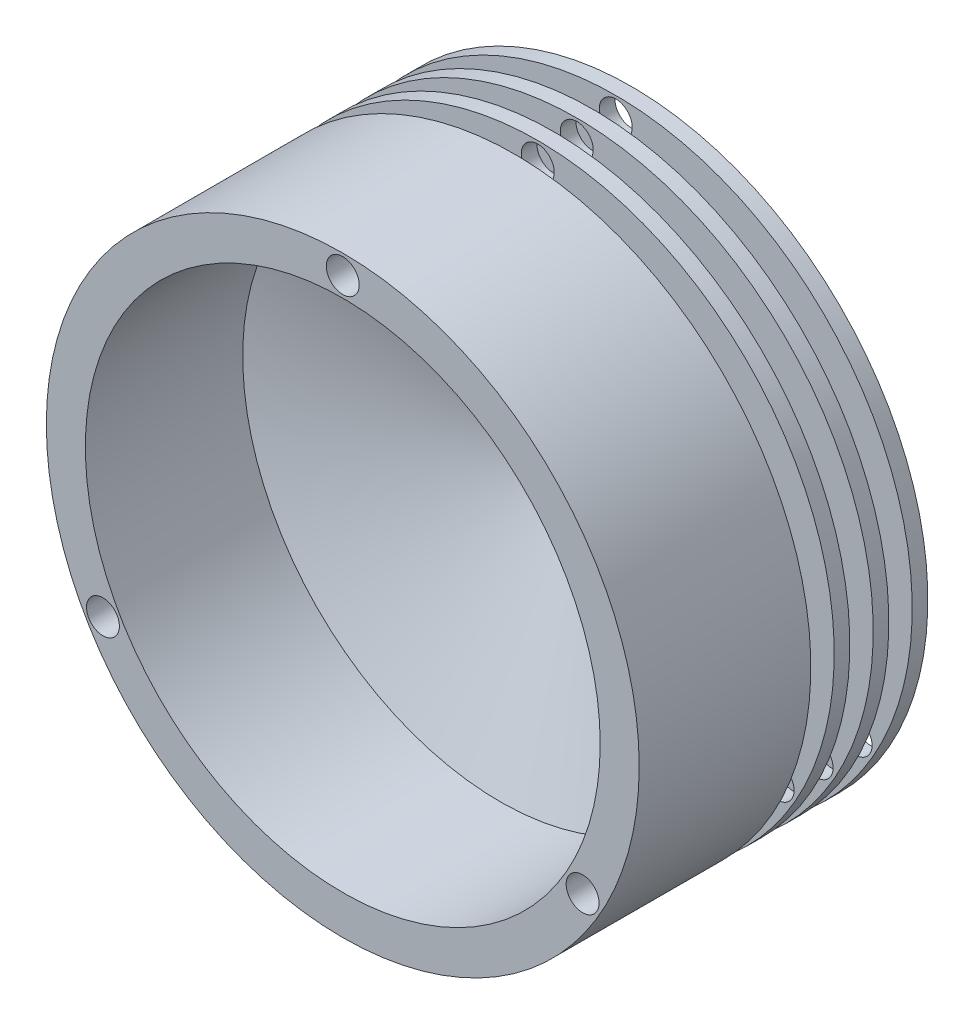
ISO-10303-21;
HEADER;
FILE_DESCRIPTION(('STEP AP214'),'2;1');
FILE_NAME('part.step','',(''),(''),'','','');
FILE_SCHEMA(('AUTOMOTIVE_DESIGN { 1 0 10303 214 1 1 1 1 }'));
ENDSEC;
DATA;
#1=APPLICATION_CONTEXT('core data for automotive mechanical design processes');
#2=APPLICATION_PROTOCOL_DEFINITION('international standard','automotive_design',2000,#1);
#3=PRODUCT_CONTEXT('',#1,'mechanical');
#4=PRODUCT('Part','Part','',(#3));
#5=PRODUCT_RELATED_PRODUCT_CATEGORY('part','',(#4));
#6=PRODUCT_DEFINITION_FORMATION('','',#4);
#7=PRODUCT_DEFINITION_CONTEXT('part definition',#1,'design');
#8=PRODUCT_DEFINITION('design','',#6,#7);
#9=PRODUCT_DEFINITION_SHAPE('','',#8);
#10=(LENGTH_UNIT() NAMED_UNIT(*) SI_UNIT(.MILLI.,.METRE.));
#11=(NAMED_UNIT(*) PLANE_ANGLE_UNIT() SI_UNIT($,.RADIAN.));
#12=(NAMED_UNIT(*) SI_UNIT($,.STERADIAN.) SOLID_ANGLE_UNIT());
#13=UNCERTAINTY_MEASURE_WITH_UNIT(LENGTH_MEASURE(1.E-05),#10,'distance_accuracy_value','');
#14=(GEOMETRIC_REPRESENTATION_CONTEXT(3) GLOBAL_UNCERTAINTY_ASSIGNED_CONTEXT((#13)) GLOBAL_UNIT_ASSIGNED_CONTEXT((#10,
#11,#12)) REPRESENTATION_CONTEXT('',''));
#15=CARTESIAN_POINT('',(0.,0.,0.));
#16=DIRECTION('',(0.,0.,1.));
#17=DIRECTION('',(1.,0.,0.));
#18=AXIS2_PLACEMENT_3D('',#15,#16,#17);
#19=CARTESIAN_POINT('',(0.,0.,20.));
#20=DIRECTION('',(0.,0.,-1.));
#21=DIRECTION('',(-1.,0.,0.));
#22=AXIS2_PLACEMENT_3D('',#19,#20,#21);
#23=CYLINDRICAL_SURFACE('',#22,38.);
#24=CARTESIAN_POINT('',(0.,0.,20.));
#25=DIRECTION('',(0.,0.,1.));
#26=DIRECTION('',(1.,0.,0.));
#27=AXIS2_PLACEMENT_3D('',#24,#25,#26);
#28=CIRCLE('',#27,38.);
#29=CARTESIAN_POINT('',(38.,0.,20.));
#30=VERTEX_POINT('',#29);
#31=EDGE_CURVE('E55',#30,#30,#28,.T.);
#32=ORIENTED_EDGE('',*,*,#31,.F.);
#33=EDGE_LOOP('',(#32));
#34=FACE_BOUND('',#33,.T.);
#35=CARTESIAN_POINT('',(0.,0.,-2.));
#36=DIRECTION('',(0.,0.,-1.));
#37=DIRECTION('',(-1.,0.,0.));
#38=AXIS2_PLACEMENT_3D('',#35,#36,#37);
#39=CIRCLE('',#38,38.);
#40=CARTESIAN_POINT('',(-38.,0.,-2.));
#41=VERTEX_POINT('',#40);
#42=EDGE_CURVE('E160',#41,#41,#39,.T.);
#43=ORIENTED_EDGE('',*,*,#42,.F.);
#44=EDGE_LOOP('',(#43));
#45=FACE_BOUND('',#44,.T.);
#46=ADVANCED_FACE('F39',(#34,#45),#23,.T.);
#47=CARTESIAN_POINT('',(0.,0.,-15.));
#48=DIRECTION('',(0.,0.,-1.));
#49=DIRECTION('',(-1.,0.,0.));
#50=AXIS2_PLACEMENT_3D('',#47,#48,#49);
#51=CIRCLE('',#50,38.);
#52=CARTESIAN_POINT('',(-38.,0.,-15.));
#53=VERTEX_POINT('',#52);
#54=EDGE_CURVE('E137',#53,#53,#51,.T.);
#55=ORIENTED_EDGE('',*,*,#54,.T.);
#56=EDGE_LOOP('',(#55));
#57=FACE_BOUND('',#56,.T.);
#58=CARTESIAN_POINT('',(0.,0.,-17.));
#59=DIRECTION('',(0.,0.,-1.));
#60=DIRECTION('',(-1.,0.,0.));
#61=AXIS2_PLACEMENT_3D('',#58,#59,#60);
#62=CIRCLE('',#61,38.);
#63=CARTESIAN_POINT('',(-38.,0.,-17.));
#64=VERTEX_POINT('',#63);
#65=EDGE_CURVE('E185',#64,#64,#62,.T.);
#66=ORIENTED_EDGE('',*,*,#65,.F.);
#67=EDGE_LOOP('',(#66));
#68=FACE_BOUND('',#67,.T.);
#69=ADVANCED_FACE('F208',(#57,#68),#23,.T.);
#70=CARTESIAN_POINT('',(0.,0.,-20.));
#71=DIRECTION('',(0.,0.,-1.));
#72=DIRECTION('',(-1.,0.,0.));
#73=AXIS2_PLACEMENT_3D('',#70,#71,#72);
#74=PLANE('',#73);
#75=CARTESIAN_POINT('',(0.,0.,-20.));
#76=DIRECTION('',(0.,0.,-1.));
#77=DIRECTION('',(-1.,0.,0.));
#78=AXIS2_PLACEMENT_3D('',#75,#76,#77);
#79=CIRCLE('',#78,6.);
#80=CARTESIAN_POINT('',(-6.,0.,-20.));
#81=VERTEX_POINT('',#80);
#82=EDGE_CURVE('E192',#81,#81,#79,.T.);
#83=ORIENTED_EDGE('',*,*,#82,.F.);
#84=EDGE_LOOP('',(#83));
#85=FACE_BOUND('',#84,.T.);
#86=CARTESIAN_POINT('',(0.,0.,-20.));
#87=DIRECTION('',(0.,0.,-1.));
#88=DIRECTION('',(-1.,0.,0.));
#89=AXIS2_PLACEMENT_3D('',#86,#87,#88);
#90=CIRCLE('',#89,29.);
#91=CARTESIAN_POINT('',(-29.,0.,-20.));
#92=VERTEX_POINT('',#91);
#93=EDGE_CURVE('E147',#92,#92,#90,.T.);
#94=ORIENTED_EDGE('',*,*,#93,.T.);
#95=EDGE_LOOP('',(#94));
#96=FACE_BOUND('',#95,.T.);
#97=ADVANCED_FACE('F241',(#85,#96),#74,.T.);
#98=CARTESIAN_POINT('',(0.,0.,20.));
#99=DIRECTION('',(0.,0.,1.));
#100=DIRECTION('',(1.,0.,0.));
#101=AXIS2_PLACEMENT_3D('',#98,#99,#100);
#102=PLANE('',#101);
#103=CARTESIAN_POINT('',(30.7439018343477,-17.7499999999997,20.));
#104=DIRECTION('',(0.,0.,1.));
#105=DIRECTION('',(1.,0.,0.));
#106=AXIS2_PLACEMENT_3D('',#103,#104,#105);
#107=CIRCLE('',#106,2.10819999999999);
#108=CARTESIAN_POINT('',(32.8521018343477,-17.7499999999997,20.));
#109=VERTEX_POINT('',#108);
#110=EDGE_CURVE('E484',#109,#109,#107,.T.);
#111=ORIENTED_EDGE('',*,*,#110,.F.);
#112=EDGE_LOOP('',(#111));
#113=FACE_BOUND('',#112,.T.);
#114=CARTESIAN_POINT('',(-30.7439018343475,-17.7500000000001,20.));
#115=DIRECTION('',(0.,0.,1.));
#116=DIRECTION('',(1.,0.,0.));
#117=AXIS2_PLACEMENT_3D('',#114,#115,#116);
#118=CIRCLE('',#117,2.10819999999999);
#119=CARTESIAN_POINT('',(-28.6357018343475,-17.7500000000001,20.));
#120=VERTEX_POINT('',#119);
#121=EDGE_CURVE('E68',#120,#120,#118,.T.);
#122=ORIENTED_EDGE('',*,*,#121,.F.);
#123=EDGE_LOOP('',(#122));
#124=FACE_BOUND('',#123,.T.);
#125=CARTESIAN_POINT('',(0.,35.5,20.));
#126=DIRECTION('',(0.,0.,1.));
#127=DIRECTION('',(1.,0.,0.));
#128=AXIS2_PLACEMENT_3D('',#125,#126,#127);
#129=CIRCLE('',#128,2.10819999999999);
#130=CARTESIAN_POINT('',(2.10819999999999,35.5,20.));
#131=VERTEX_POINT('',#130);
#132=EDGE_CURVE('E63',#131,#131,#129,.T.);
#133=ORIENTED_EDGE('',*,*,#132,.F.);
#134=EDGE_LOOP('',(#133));
#135=FACE_BOUND('',#134,.T.);
#136=ORIENTED_EDGE('',*,*,#31,.T.);
#137=EDGE_LOOP('',(#136));
#138=FACE_BOUND('',#137,.T.);
#139=CARTESIAN_POINT('',(0.,0.,20.));
#140=DIRECTION('',(0.,0.,1.));
#141=DIRECTION('',(1.,0.,0.));
#142=AXIS2_PLACEMENT_3D('',#139,#140,#141);
#143=CIRCLE('',#142,33.);
#144=CARTESIAN_POINT('',(33.,0.,20.));
#145=VERTEX_POINT('',#144);
#146=EDGE_CURVE('E196',#145,#145,#143,.T.);
#147=ORIENTED_EDGE('',*,*,#146,.F.);
#148=EDGE_LOOP('',(#147));
#149=FACE_BOUND('',#148,.T.);
#150=ADVANCED_FACE('F203',(#113,#124,#135,#138,#149),#102,.T.);
#151=CARTESIAN_POINT('',(0.,0.,20.));
#152=DIRECTION('',(0.,0.,-1.));
#153=DIRECTION('',(-1.,0.,0.));
#154=AXIS2_PLACEMENT_3D('',#151,#152,#153);
#155=CYLINDRICAL_SURFACE('',#154,33.);
#156=CARTESIAN_POINT('',(0.,0.,-0.17280367481282));
#157=DIRECTION('',(0.,0.,1.));
#158=DIRECTION('',(1.,0.,0.));
#159=AXIS2_PLACEMENT_3D('',#156,#157,#158);
#160=CIRCLE('',#159,33.);
#161=CARTESIAN_POINT('',(33.,0.,-0.17280367481282));
#162=VERTEX_POINT('',#161);
#163=EDGE_CURVE('E10',#162,#162,#160,.F.);
#164=ORIENTED_EDGE('',*,*,#163,.T.);
#165=EDGE_LOOP('',(#164));
#166=FACE_BOUND('',#165,.T.);
#167=ORIENTED_EDGE('',*,*,#146,.T.);
#168=EDGE_LOOP('',(#167));
#169=FACE_BOUND('',#168,.T.);
#170=ADVANCED_FACE('F239',(#166,#169),#155,.F.);
#171=CARTESIAN_POINT('',(0.,0.,-20.));
#172=DIRECTION('',(0.,0.,1.));
#173=DIRECTION('',(1.,0.,0.));
#174=AXIS2_PLACEMENT_3D('',#171,#172,#173);
#175=CYLINDRICAL_SURFACE('',#174,6.);
#176=CARTESIAN_POINT('',(0.,0.,-10.0000000000002));
#177=DIRECTION('',(0.,0.,-1.));
#178=DIRECTION('',(-1.,0.,0.));
#179=AXIS2_PLACEMENT_3D('',#176,#177,#178);
#180=CIRCLE('',#179,6.);
#181=CARTESIAN_POINT('',(6.,0.,-10.0000000000002));
#182=VERTEX_POINT('',#181);
#183=EDGE_CURVE('E49',#182,#182,#180,.F.);
#184=ORIENTED_EDGE('',*,*,#183,.T.);
#185=EDGE_LOOP('',(#184));
#186=FACE_BOUND('',#185,.T.);
#187=ORIENTED_EDGE('',*,*,#82,.T.);
#188=EDGE_LOOP('',(#187));
#189=FACE_BOUND('',#188,.T.);
#190=ADVANCED_FACE('F236',(#186,#189),#175,.F.);
#191=CARTESIAN_POINT('',(0.,0.,0.));
#192=DIRECTION('',(0.,0.,1.));
#193=DIRECTION('',(1.,0.,0.));
#194=AXIS2_PLACEMENT_3D('',#191,#192,#193);
#195=CONICAL_SURFACE('',#194,33.474774194547,1.22173047639603);
#196=CARTESIAN_POINT('',(6.,0.,-10.0000000000002));
#197=CARTESIAN_POINT('',(6.28125,0.,-9.89763337161282));
#198=CARTESIAN_POINT('',(6.5625,0.,-9.79526674322546));
#199=CARTESIAN_POINT('',(7.125,0.,-9.59053348645072));
#200=CARTESIAN_POINT('',(7.40625,0.,-9.48816685806335));
#201=CARTESIAN_POINT('',(7.96875,0.,-9.28343360128861));
#202=CARTESIAN_POINT('',(8.25,0.,-9.18106697290125));
#203=CARTESIAN_POINT('',(8.8125,0.,-8.97633371612651));
#204=CARTESIAN_POINT('',(9.09375,0.,-8.87396708773914));
#205=CARTESIAN_POINT('',(9.65625,0.,-8.6692338309644));
#206=CARTESIAN_POINT('',(9.9375,0.,-8.56686720257703));
#207=CARTESIAN_POINT('',(10.5,0.,-8.3621339458023));
#208=CARTESIAN_POINT('',(10.78125,0.,-8.25976731741493));
#209=CARTESIAN_POINT('',(11.34375,0.,-8.05503406064019));
#210=CARTESIAN_POINT('',(11.625,0.,-7.95266743225282));
#211=CARTESIAN_POINT('',(12.1875,0.,-7.74793417547809));
#212=CARTESIAN_POINT('',(12.46875,0.,-7.64556754709072));
#213=CARTESIAN_POINT('',(13.03125,0.,-7.44083429031598));
#214=CARTESIAN_POINT('',(13.3125,0.,-7.33846766192861));
#215=CARTESIAN_POINT('',(13.875,0.,-7.13373440515388));
#216=CARTESIAN_POINT('',(14.15625,0.,-7.03136777676651));
#217=CARTESIAN_POINT('',(14.71875,0.,-6.82663451999177));
#218=CARTESIAN_POINT('',(15.,0.,-6.7242678916044));
#219=CARTESIAN_POINT('',(15.5625,0.,-6.51953463482966));
#220=CARTESIAN_POINT('',(15.84375,0.,-6.4171680064423));
#221=CARTESIAN_POINT('',(16.40625,0.,-6.21243474966756));
#222=CARTESIAN_POINT('',(16.6875,0.,-6.11006812128019));
#223=CARTESIAN_POINT('',(17.25,0.,-5.90533486450545));
#224=CARTESIAN_POINT('',(17.53125,0.,-5.80296823611809));
#225=CARTESIAN_POINT('',(18.09375,0.,-5.59823497934335));
#226=CARTESIAN_POINT('',(18.375,0.,-5.49586835095598));
#227=CARTESIAN_POINT('',(18.9375,0.,-5.29113509418124));
#228=CARTESIAN_POINT('',(19.21875,0.,-5.18876846579388));
#229=CARTESIAN_POINT('',(19.78125,0.,-4.98403520901914));
#230=CARTESIAN_POINT('',(20.0625,0.,-4.88166858063177));
#231=CARTESIAN_POINT('',(20.625,0.,-4.67693532385703));
#232=CARTESIAN_POINT('',(20.90625,0.,-4.57456869546966));
#233=CARTESIAN_POINT('',(21.46875,0.,-4.36983543869493));
#234=CARTESIAN_POINT('',(21.75,0.,-4.26746881030756));
#235=CARTESIAN_POINT('',(22.3125,0.,-4.06273555353282));
#236=CARTESIAN_POINT('',(22.59375,0.,-3.96036892514545));
#237=CARTESIAN_POINT('',(23.15625,0.,-3.75563566837072));
#238=CARTESIAN_POINT('',(23.4375,0.,-3.65326903998335));
#239=CARTESIAN_POINT('',(24.,0.,-3.44853578320861));
#240=CARTESIAN_POINT('',(24.28125,0.,-3.34616915482124));
#241=CARTESIAN_POINT('',(24.84375,0.,-3.14143589804651));
#242=CARTESIAN_POINT('',(25.125,0.,-3.03906926965914));
#243=CARTESIAN_POINT('',(25.6875,0.,-2.8343360128844));
#244=CARTESIAN_POINT('',(25.96875,0.,-2.73196938449703));
#245=CARTESIAN_POINT('',(26.53125,0.,-2.5272361277223));
#246=CARTESIAN_POINT('',(26.8125,0.,-2.42486949933493));
#247=CARTESIAN_POINT('',(27.375,0.,-2.22013624256019));
#248=CARTESIAN_POINT('',(27.65625,0.,-2.11776961417282));
#249=CARTESIAN_POINT('',(28.21875,0.,-1.91303635739808));
#250=CARTESIAN_POINT('',(28.5,0.,-1.81066972901072));
#251=CARTESIAN_POINT('',(29.0625,0.,-1.60593647223598));
#252=CARTESIAN_POINT('',(29.34375,0.,-1.50356984384861));
#253=CARTESIAN_POINT('',(29.90625,0.,-1.29883658707387));
#254=CARTESIAN_POINT('',(30.1875,0.,-1.19646995868651));
#255=CARTESIAN_POINT('',(30.75,0.,-0.991736701911769));
#256=CARTESIAN_POINT('',(31.03125,0.,-0.8893700735244));
#257=CARTESIAN_POINT('',(31.59375,0.,-0.684636816749663));
#258=CARTESIAN_POINT('',(31.875,0.,-0.582270188362294));
#259=CARTESIAN_POINT('',(32.4375,0.,-0.377536931587557));
#260=CARTESIAN_POINT('',(32.71875,0.,-0.275170303200189));
#261=CARTESIAN_POINT('',(33.,0.,-0.172803674812821));
#262=B_SPLINE_CURVE_WITH_KNOTS('',3,(#196,#197,#198,#199,#200,#201,#202,#203,#204,#205,#206,
#207,#208,#209,#210,#211,#212,#213,#214,#215,#216,#217,#218,#219,#220,#221,#222,#223,#224,#225,
#226,#227,#228,#229,#230,#231,#232,#233,#234,#235,#236,#237,#238,#239,#240,#241,#242,#243,#244,
#245,#246,#247,#248,#249,#250,#251,#252,#253,#254,#255,#256,#257,#258,#259,#260,#261),
.UNSPECIFIED.,.F.,.F.,(4,2,2,2,2,2,2,2,2,2,2,2,2,2,2,2,2,2,2,2,2,2,2,2,2,2,2,2,2,2,2,2,4),(0.,
0.897899995526547,1.7957999910531,2.69369998657965,3.5915999821062,4.48949997763275,
5.3873999731593,6.28529996868585,7.1831999642124,8.08109995973895,8.9789999552655,
9.87689995079205,10.7747999463186,11.6726999418451,12.5705999373717,13.4684999328982,
14.3663999284248,15.2642999239513,16.1621999194779,17.0600999150044,17.957999910531,
18.8558999060575,19.7537999015841,20.6516998971106,21.5495998926372,22.4474998881637,
23.3453998836903,24.2432998792168,25.1411998747434,26.0390998702699,26.9369998657965,
27.834899861323,28.7327998568496),.UNSPECIFIED.);
#263=EDGE_CURVE('BSEAM42',#182,#162,#262,.T.);
#264=ORIENTED_EDGE('',*,*,#183,.F.);
#265=ORIENTED_EDGE('',*,*,#163,.F.);
#266=ORIENTED_EDGE('',*,*,#263,.T.);
#267=ORIENTED_EDGE('',*,*,#263,.F.);
#268=EDGE_LOOP('',(#264,#266,#265,#267));
#269=FACE_BOUND('',#268,.T.);
#270=ADVANCED_FACE('F42',(#269),#195,.F.);
#271=CARTESIAN_POINT('',(0.,0.,-17.));
#272=DIRECTION('',(0.,0.,-1.));
#273=DIRECTION('',(-1.,0.,0.));
#274=AXIS2_PLACEMENT_3D('',#271,#272,#273);
#275=PLANE('',#274);
#276=CARTESIAN_POINT('',(30.7439018343477,-17.7499999999997,-17.));
#277=DIRECTION('',(0.,0.,-1.));
#278=DIRECTION('',(-1.,0.,0.));
#279=AXIS2_PLACEMENT_3D('',#276,#277,#278);
#280=CIRCLE('',#279,2.10819999999999);
#281=CARTESIAN_POINT('',(28.6357018343477,-17.7499999999997,-17.));
#282=VERTEX_POINT('',#281);
#283=EDGE_CURVE('E83',#282,#282,#280,.T.);
#284=ORIENTED_EDGE('',*,*,#283,.F.);
#285=EDGE_LOOP('',(#284));
#286=FACE_BOUND('',#285,.T.);
#287=CARTESIAN_POINT('',(-30.7439018343475,-17.7500000000001,-17.));
#288=DIRECTION('',(0.,0.,-1.));
#289=DIRECTION('',(-1.,0.,0.));
#290=AXIS2_PLACEMENT_3D('',#287,#288,#289);
#291=CIRCLE('',#290,2.10819999999999);
#292=CARTESIAN_POINT('',(-32.8521018343475,-17.7500000000001,-17.));
#293=VERTEX_POINT('',#292);
#294=EDGE_CURVE('E102',#293,#293,#291,.T.);
#295=ORIENTED_EDGE('',*,*,#294,.F.);
#296=EDGE_LOOP('',(#295));
#297=FACE_BOUND('',#296,.T.);
#298=CARTESIAN_POINT('',(0.,35.5,-17.));
#299=DIRECTION('',(0.,0.,-1.));
#300=DIRECTION('',(-1.,0.,0.));
#301=AXIS2_PLACEMENT_3D('',#298,#299,#300);
#302=CIRCLE('',#301,2.10819999999999);
#303=CARTESIAN_POINT('',(-2.10819999999999,35.5,-17.));
#304=VERTEX_POINT('',#303);
#305=EDGE_CURVE('E128',#304,#304,#302,.T.);
#306=ORIENTED_EDGE('',*,*,#305,.F.);
#307=EDGE_LOOP('',(#306));
#308=FACE_BOUND('',#307,.T.);
#309=CARTESIAN_POINT('',(0.,0.,-17.));
#310=DIRECTION('',(0.,0.,-1.));
#311=DIRECTION('',(-1.,0.,0.));
#312=AXIS2_PLACEMENT_3D('',#309,#310,#311);
#313=CIRCLE('',#312,29.);
#314=CARTESIAN_POINT('',(-29.,0.,-17.));
#315=VERTEX_POINT('',#314);
#316=EDGE_CURVE('E181',#315,#315,#313,.T.);
#317=ORIENTED_EDGE('',*,*,#316,.F.);
#318=EDGE_LOOP('',(#317));
#319=FACE_BOUND('',#318,.T.);
#320=ORIENTED_EDGE('',*,*,#65,.T.);
#321=EDGE_LOOP('',(#320));
#322=FACE_BOUND('',#321,.T.);
#323=ADVANCED_FACE('F225',(#286,#297,#308,#319,#322),#275,.T.);
#324=CARTESIAN_POINT('',(0.,0.,-17.));
#325=DIRECTION('',(0.,0.,-1.));
#326=DIRECTION('',(-1.,0.,0.));
#327=AXIS2_PLACEMENT_3D('',#324,#325,#326);
#328=CYLINDRICAL_SURFACE('',#327,29.);
#329=ORIENTED_EDGE('',*,*,#316,.T.);
#330=EDGE_LOOP('',(#329));
#331=FACE_BOUND('',#330,.T.);
#332=ORIENTED_EDGE('',*,*,#93,.F.);
#333=EDGE_LOOP('',(#332));
#334=FACE_BOUND('',#333,.T.);
#335=ADVANCED_FACE('F215',(#331,#334),#328,.T.);
#336=CARTESIAN_POINT('',(0.,0.,-2.));
#337=DIRECTION('',(0.,0.,-1.));
#338=DIRECTION('',(-1.,0.,0.));
#339=AXIS2_PLACEMENT_3D('',#336,#337,#338);
#340=PLANE('',#339);
#341=CARTESIAN_POINT('',(30.7439018343477,-17.7499999999997,-2.));
#342=DIRECTION('',(0.,0.,-1.));
#343=DIRECTION('',(-1.,0.,0.));
#344=AXIS2_PLACEMENT_3D('',#341,#342,#343);
#345=CIRCLE('',#344,2.10819999999999);
#346=CARTESIAN_POINT('',(28.6357018343477,-17.7499999999997,-2.));
#347=VERTEX_POINT('',#346);
#348=EDGE_CURVE('E77',#347,#347,#345,.T.);
#349=ORIENTED_EDGE('',*,*,#348,.F.);
#350=EDGE_LOOP('',(#349));
#351=FACE_BOUND('',#350,.T.);
#352=CARTESIAN_POINT('',(-30.7439018343475,-17.7500000000001,-2.));
#353=DIRECTION('',(0.,0.,-1.));
#354=DIRECTION('',(-1.,0.,0.));
#355=AXIS2_PLACEMENT_3D('',#352,#353,#354);
#356=CIRCLE('',#355,2.10819999999999);
#357=CARTESIAN_POINT('',(-32.8521018343475,-17.7500000000001,-2.));
#358=VERTEX_POINT('',#357);
#359=EDGE_CURVE('E98',#358,#358,#356,.T.);
#360=ORIENTED_EDGE('',*,*,#359,.F.);
#361=EDGE_LOOP('',(#360));
#362=FACE_BOUND('',#361,.T.);
#363=CARTESIAN_POINT('',(0.,35.5,-2.));
#364=DIRECTION('',(0.,0.,-1.));
#365=DIRECTION('',(-1.,0.,0.));
#366=AXIS2_PLACEMENT_3D('',#363,#364,#365);
#367=CIRCLE('',#366,2.10819999999999);
#368=CARTESIAN_POINT('',(-2.10819999999999,35.5,-2.));
#369=VERTEX_POINT('',#368);
#370=EDGE_CURVE('E124',#369,#369,#367,.T.);
#371=ORIENTED_EDGE('',*,*,#370,.F.);
#372=EDGE_LOOP('',(#371));
#373=FACE_BOUND('',#372,.T.);
#374=CARTESIAN_POINT('',(0.,0.,-2.));
#375=DIRECTION('',(0.,0.,-1.));
#376=DIRECTION('',(-1.,0.,0.));
#377=AXIS2_PLACEMENT_3D('',#374,#375,#376);
#378=CIRCLE('',#377,29.);
#379=CARTESIAN_POINT('',(-29.,0.,-2.));
#380=VERTEX_POINT('',#379);
#381=EDGE_CURVE('E167',#380,#380,#378,.T.);
#382=ORIENTED_EDGE('',*,*,#381,.F.);
#383=EDGE_LOOP('',(#382));
#384=FACE_BOUND('',#383,.T.);
#385=ORIENTED_EDGE('',*,*,#42,.T.);
#386=EDGE_LOOP('',(#385));
#387=FACE_BOUND('',#386,.T.);
#388=ADVANCED_FACE('F212',(#351,#362,#373,#384,#387),#340,.T.);
#389=CARTESIAN_POINT('',(0.,0.,-5.));
#390=DIRECTION('',(0.,0.,-1.));
#391=DIRECTION('',(-1.,0.,0.));
#392=AXIS2_PLACEMENT_3D('',#389,#390,#391);
#393=PLANE('',#392);
#394=CARTESIAN_POINT('',(30.7439018343477,-17.7499999999997,-5.));
#395=DIRECTION('',(0.,0.,-1.));
#396=DIRECTION('',(-1.,0.,0.));
#397=AXIS2_PLACEMENT_3D('',#394,#395,#396);
#398=CIRCLE('',#397,2.10819999999999);
#399=CARTESIAN_POINT('',(28.6357018343477,-17.7499999999997,-5.));
#400=VERTEX_POINT('',#399);
#401=EDGE_CURVE('E500',#400,#400,#398,.T.);
#402=ORIENTED_EDGE('',*,*,#401,.T.);
#403=EDGE_LOOP('',(#402));
#404=FACE_BOUND('',#403,.T.);
#405=CARTESIAN_POINT('',(-30.7439018343475,-17.7500000000001,-5.));
#406=DIRECTION('',(0.,0.,-1.));
#407=DIRECTION('',(-1.,0.,0.));
#408=AXIS2_PLACEMENT_3D('',#405,#406,#407);
#409=CIRCLE('',#408,2.10819999999999);
#410=CARTESIAN_POINT('',(-32.8521018343475,-17.7500000000001,-5.));
#411=VERTEX_POINT('',#410);
#412=EDGE_CURVE('E94',#411,#411,#409,.T.);
#413=ORIENTED_EDGE('',*,*,#412,.T.);
#414=EDGE_LOOP('',(#413));
#415=FACE_BOUND('',#414,.T.);
#416=CARTESIAN_POINT('',(0.,35.5,-5.));
#417=DIRECTION('',(0.,0.,-1.));
#418=DIRECTION('',(-1.,0.,0.));
#419=AXIS2_PLACEMENT_3D('',#416,#417,#418);
#420=CIRCLE('',#419,2.10819999999999);
#421=CARTESIAN_POINT('',(-2.10819999999999,35.5,-5.));
#422=VERTEX_POINT('',#421);
#423=EDGE_CURVE('E120',#422,#422,#420,.T.);
#424=ORIENTED_EDGE('',*,*,#423,.T.);
#425=EDGE_LOOP('',(#424));
#426=FACE_BOUND('',#425,.T.);
#427=CARTESIAN_POINT('',(0.,0.,-5.));
#428=DIRECTION('',(0.,0.,-1.));
#429=DIRECTION('',(-1.,0.,0.));
#430=AXIS2_PLACEMENT_3D('',#427,#428,#429);
#431=CIRCLE('',#430,29.);
#432=CARTESIAN_POINT('',(-29.,0.,-5.));
#433=VERTEX_POINT('',#432);
#434=EDGE_CURVE('E132',#433,#433,#431,.T.);
#435=ORIENTED_EDGE('',*,*,#434,.T.);
#436=EDGE_LOOP('',(#435));
#437=FACE_BOUND('',#436,.T.);
#438=CARTESIAN_POINT('',(0.,0.,-5.));
#439=DIRECTION('',(0.,0.,-1.));
#440=DIRECTION('',(-1.,0.,0.));
#441=AXIS2_PLACEMENT_3D('',#438,#439,#440);
#442=CIRCLE('',#441,38.);
#443=CARTESIAN_POINT('',(-38.,0.,-5.));
#444=VERTEX_POINT('',#443);
#445=EDGE_CURVE('E171',#444,#444,#442,.T.);
#446=ORIENTED_EDGE('',*,*,#445,.F.);
#447=EDGE_LOOP('',(#446));
#448=FACE_BOUND('',#447,.T.);
#449=ADVANCED_FACE('F214',(#404,#415,#426,#437,#448),#393,.F.);
#450=CARTESIAN_POINT('',(0.,0.,-2.));
#451=DIRECTION('',(0.,0.,-1.));
#452=DIRECTION('',(-1.,0.,0.));
#453=AXIS2_PLACEMENT_3D('',#450,#451,#452);
#454=CYLINDRICAL_SURFACE('',#453,29.);
#455=ORIENTED_EDGE('',*,*,#381,.T.);
#456=EDGE_LOOP('',(#455));
#457=FACE_BOUND('',#456,.T.);
#458=ORIENTED_EDGE('',*,*,#434,.F.);
#459=EDGE_LOOP('',(#458));
#460=FACE_BOUND('',#459,.T.);
#461=ADVANCED_FACE('F222',(#457,#460),#454,.T.);
#462=CARTESIAN_POINT('',(0.,0.,-12.));
#463=DIRECTION('',(0.,0.,-1.));
#464=DIRECTION('',(-1.,0.,0.));
#465=AXIS2_PLACEMENT_3D('',#462,#463,#464);
#466=PLANE('',#465);
#467=CARTESIAN_POINT('',(30.7439018343477,-17.7499999999997,-12.));
#468=DIRECTION('',(0.,0.,-1.));
#469=DIRECTION('',(-1.,0.,0.));
#470=AXIS2_PLACEMENT_3D('',#467,#468,#469);
#471=CIRCLE('',#470,2.10819999999999);
#472=CARTESIAN_POINT('',(28.6357018343477,-17.7499999999997,-12.));
#473=VERTEX_POINT('',#472);
#474=EDGE_CURVE('E496',#473,#473,#471,.T.);
#475=ORIENTED_EDGE('',*,*,#474,.F.);
#476=EDGE_LOOP('',(#475));
#477=FACE_BOUND('',#476,.T.);
#478=CARTESIAN_POINT('',(-30.7439018343475,-17.7500000000001,-12.));
#479=DIRECTION('',(0.,0.,-1.));
#480=DIRECTION('',(-1.,0.,0.));
#481=AXIS2_PLACEMENT_3D('',#478,#479,#480);
#482=CIRCLE('',#481,2.10819999999999);
#483=CARTESIAN_POINT('',(-32.8521018343475,-17.7500000000001,-12.));
#484=VERTEX_POINT('',#483);
#485=EDGE_CURVE('E90',#484,#484,#482,.T.);
#486=ORIENTED_EDGE('',*,*,#485,.F.);
#487=EDGE_LOOP('',(#486));
#488=FACE_BOUND('',#487,.T.);
#489=CARTESIAN_POINT('',(0.,35.5,-12.));
#490=DIRECTION('',(0.,0.,-1.));
#491=DIRECTION('',(-1.,0.,0.));
#492=AXIS2_PLACEMENT_3D('',#489,#490,#491);
#493=CIRCLE('',#492,2.10819999999999);
#494=CARTESIAN_POINT('',(-2.10819999999999,35.5,-12.));
#495=VERTEX_POINT('',#494);
#496=EDGE_CURVE('E116',#495,#495,#493,.T.);
#497=ORIENTED_EDGE('',*,*,#496,.F.);
#498=EDGE_LOOP('',(#497));
#499=FACE_BOUND('',#498,.T.);
#500=CARTESIAN_POINT('',(0.,0.,-12.));
#501=DIRECTION('',(0.,0.,-1.));
#502=DIRECTION('',(-1.,0.,0.));
#503=AXIS2_PLACEMENT_3D('',#500,#501,#502);
#504=CIRCLE('',#503,29.);
#505=CARTESIAN_POINT('',(-29.,0.,-12.));
#506=VERTEX_POINT('',#505);
#507=EDGE_CURVE('E133',#506,#506,#504,.T.);
#508=ORIENTED_EDGE('',*,*,#507,.F.);
#509=EDGE_LOOP('',(#508));
#510=FACE_BOUND('',#509,.T.);
#511=CARTESIAN_POINT('',(0.,0.,-12.));
#512=DIRECTION('',(0.,0.,-1.));
#513=DIRECTION('',(-1.,0.,0.));
#514=AXIS2_PLACEMENT_3D('',#511,#512,#513);
#515=CIRCLE('',#514,38.);
#516=CARTESIAN_POINT('',(-38.,0.,-12.));
#517=VERTEX_POINT('',#516);
#518=EDGE_CURVE('E143',#517,#517,#515,.T.);
#519=ORIENTED_EDGE('',*,*,#518,.T.);
#520=EDGE_LOOP('',(#519));
#521=FACE_BOUND('',#520,.T.);
#522=ADVANCED_FACE('F271',(#477,#488,#499,#510,#521),#466,.T.);
#523=CARTESIAN_POINT('',(0.,0.,-15.));
#524=DIRECTION('',(0.,0.,-1.));
#525=DIRECTION('',(-1.,0.,0.));
#526=AXIS2_PLACEMENT_3D('',#523,#524,#525);
#527=PLANE('',#526);
#528=CARTESIAN_POINT('',(30.7439018343477,-17.7499999999997,-15.));
#529=DIRECTION('',(0.,0.,-1.));
#530=DIRECTION('',(-1.,0.,0.));
#531=AXIS2_PLACEMENT_3D('',#528,#529,#530);
#532=CIRCLE('',#531,2.10819999999999);
#533=CARTESIAN_POINT('',(28.6357018343477,-17.7499999999997,-15.));
#534=VERTEX_POINT('',#533);
#535=EDGE_CURVE('E492',#534,#534,#532,.T.);
#536=ORIENTED_EDGE('',*,*,#535,.T.);
#537=EDGE_LOOP('',(#536));
#538=FACE_BOUND('',#537,.T.);
#539=CARTESIAN_POINT('',(-30.7439018343475,-17.7500000000001,-15.));
#540=DIRECTION('',(0.,0.,-1.));
#541=DIRECTION('',(-1.,0.,0.));
#542=AXIS2_PLACEMENT_3D('',#539,#540,#541);
#543=CIRCLE('',#542,2.10819999999999);
#544=CARTESIAN_POINT('',(-32.8521018343475,-17.7500000000001,-15.));
#545=VERTEX_POINT('',#544);
#546=EDGE_CURVE('E74',#545,#545,#543,.T.);
#547=ORIENTED_EDGE('',*,*,#546,.T.);
#548=EDGE_LOOP('',(#547));
#549=FACE_BOUND('',#548,.T.);
#550=CARTESIAN_POINT('',(0.,35.5,-15.));
#551=DIRECTION('',(0.,0.,-1.));
#552=DIRECTION('',(-1.,0.,0.));
#553=AXIS2_PLACEMENT_3D('',#550,#551,#552);
#554=CIRCLE('',#553,2.10819999999999);
#555=CARTESIAN_POINT('',(-2.10819999999999,35.5,-15.));
#556=VERTEX_POINT('',#555);
#557=EDGE_CURVE('E62',#556,#556,#554,.T.);
#558=ORIENTED_EDGE('',*,*,#557,.T.);
#559=EDGE_LOOP('',(#558));
#560=FACE_BOUND('',#559,.T.);
#561=CARTESIAN_POINT('',(0.,0.,-15.));
#562=DIRECTION('',(0.,0.,-1.));
#563=DIRECTION('',(-1.,0.,0.));
#564=AXIS2_PLACEMENT_3D('',#561,#562,#563);
#565=CIRCLE('',#564,29.);
#566=CARTESIAN_POINT('',(-29.,0.,-15.));
#567=VERTEX_POINT('',#566);
#568=EDGE_CURVE('E138',#567,#567,#565,.T.);
#569=ORIENTED_EDGE('',*,*,#568,.T.);
#570=EDGE_LOOP('',(#569));
#571=FACE_BOUND('',#570,.T.);
#572=ORIENTED_EDGE('',*,*,#54,.F.);
#573=EDGE_LOOP('',(#572));
#574=FACE_BOUND('',#573,.T.);
#575=ADVANCED_FACE('F273',(#538,#549,#560,#571,#574),#527,.F.);
#576=CARTESIAN_POINT('',(0.,0.,-12.));
#577=DIRECTION('',(0.,0.,-1.));
#578=DIRECTION('',(-1.,0.,0.));
#579=AXIS2_PLACEMENT_3D('',#576,#577,#578);
#580=CYLINDRICAL_SURFACE('',#579,29.);
#581=ORIENTED_EDGE('',*,*,#507,.T.);
#582=EDGE_LOOP('',(#581));
#583=FACE_BOUND('',#582,.T.);
#584=ORIENTED_EDGE('',*,*,#568,.F.);
#585=EDGE_LOOP('',(#584));
#586=FACE_BOUND('',#585,.T.);
#587=ADVANCED_FACE('F265',(#583,#586),#580,.T.);
#588=ORIENTED_EDGE('',*,*,#445,.T.);
#589=EDGE_LOOP('',(#588));
#590=FACE_BOUND('',#589,.T.);
#591=CARTESIAN_POINT('',(0.,0.,-7.));
#592=DIRECTION('',(0.,0.,-1.));
#593=DIRECTION('',(-1.,0.,0.));
#594=AXIS2_PLACEMENT_3D('',#591,#592,#593);
#595=CIRCLE('',#594,38.);
#596=CARTESIAN_POINT('',(-38.,0.,-7.));
#597=VERTEX_POINT('',#596);
#598=EDGE_CURVE('E142',#597,#597,#595,.T.);
#599=ORIENTED_EDGE('',*,*,#598,.F.);
#600=EDGE_LOOP('',(#599));
#601=FACE_BOUND('',#600,.T.);
#602=ADVANCED_FACE('F209',(#590,#601),#23,.T.);
#603=CARTESIAN_POINT('',(0.,0.,-10.));
#604=DIRECTION('',(0.,0.,-1.));
#605=DIRECTION('',(-1.,0.,0.));
#606=AXIS2_PLACEMENT_3D('',#603,#604,#605);
#607=CIRCLE('',#606,38.);
#608=CARTESIAN_POINT('',(-38.,0.,-10.));
#609=VERTEX_POINT('',#608);
#610=EDGE_CURVE('E155',#609,#609,#607,.T.);
#611=ORIENTED_EDGE('',*,*,#610,.T.);
#612=EDGE_LOOP('',(#611));
#613=FACE_BOUND('',#612,.T.);
#614=ORIENTED_EDGE('',*,*,#518,.F.);
#615=EDGE_LOOP('',(#614));
#616=FACE_BOUND('',#615,.T.);
#617=ADVANCED_FACE('F251',(#613,#616),#23,.T.);
#618=CARTESIAN_POINT('',(0.,0.,-7.));
#619=DIRECTION('',(0.,0.,-1.));
#620=DIRECTION('',(-1.,0.,0.));
#621=AXIS2_PLACEMENT_3D('',#618,#619,#620);
#622=PLANE('',#621);
#623=CARTESIAN_POINT('',(30.7439018343477,-17.7499999999997,-7.));
#624=DIRECTION('',(0.,0.,-1.));
#625=DIRECTION('',(-1.,0.,0.));
#626=AXIS2_PLACEMENT_3D('',#623,#624,#625);
#627=CIRCLE('',#626,2.10819999999999);
#628=CARTESIAN_POINT('',(28.6357018343477,-17.7499999999997,-7.));
#629=VERTEX_POINT('',#628);
#630=EDGE_CURVE('E44',#629,#629,#627,.T.);
#631=ORIENTED_EDGE('',*,*,#630,.F.);
#632=EDGE_LOOP('',(#631));
#633=FACE_BOUND('',#632,.T.);
#634=CARTESIAN_POINT('',(-30.7439018343475,-17.7500000000001,-7.));
#635=DIRECTION('',(0.,0.,-1.));
#636=DIRECTION('',(-1.,0.,0.));
#637=AXIS2_PLACEMENT_3D('',#634,#635,#636);
#638=CIRCLE('',#637,2.10819999999999);
#639=CARTESIAN_POINT('',(-32.8521018343475,-17.7500000000001,-7.));
#640=VERTEX_POINT('',#639);
#641=EDGE_CURVE('E67',#640,#640,#638,.T.);
#642=ORIENTED_EDGE('',*,*,#641,.F.);
#643=EDGE_LOOP('',(#642));
#644=FACE_BOUND('',#643,.T.);
#645=CARTESIAN_POINT('',(0.,35.5,-7.));
#646=DIRECTION('',(0.,0.,-1.));
#647=DIRECTION('',(-1.,0.,0.));
#648=AXIS2_PLACEMENT_3D('',#645,#646,#647);
#649=CIRCLE('',#648,2.10819999999999);
#650=CARTESIAN_POINT('',(-2.10819999999999,35.5,-7.));
#651=VERTEX_POINT('',#650);
#652=EDGE_CURVE('E59',#651,#651,#649,.T.);
#653=ORIENTED_EDGE('',*,*,#652,.F.);
#654=EDGE_LOOP('',(#653));
#655=FACE_BOUND('',#654,.T.);
#656=CARTESIAN_POINT('',(0.,0.,-7.));
#657=DIRECTION('',(0.,0.,-1.));
#658=DIRECTION('',(-1.,0.,0.));
#659=AXIS2_PLACEMENT_3D('',#656,#657,#658);
#660=CIRCLE('',#659,29.);
#661=CARTESIAN_POINT('',(-29.,0.,-7.));
#662=VERTEX_POINT('',#661);
#663=EDGE_CURVE('E151',#662,#662,#660,.T.);
#664=ORIENTED_EDGE('',*,*,#663,.F.);
#665=EDGE_LOOP('',(#664));
#666=FACE_BOUND('',#665,.T.);
#667=ORIENTED_EDGE('',*,*,#598,.T.);
#668=EDGE_LOOP('',(#667));
#669=FACE_BOUND('',#668,.T.);
#670=ADVANCED_FACE('F256',(#633,#644,#655,#666,#669),#622,.T.);
#671=CARTESIAN_POINT('',(0.,0.,-10.));
#672=DIRECTION('',(0.,0.,-1.));
#673=DIRECTION('',(-1.,0.,0.));
#674=AXIS2_PLACEMENT_3D('',#671,#672,#673);
#675=PLANE('',#674);
#676=CARTESIAN_POINT('',(30.7439018343477,-17.7499999999997,-10.));
#677=DIRECTION('',(0.,0.,-1.));
#678=DIRECTION('',(-1.,0.,0.));
#679=AXIS2_PLACEMENT_3D('',#676,#677,#678);
#680=CIRCLE('',#679,2.10819999999999);
#681=CARTESIAN_POINT('',(28.6357018343477,-17.7499999999997,-10.));
#682=VERTEX_POINT('',#681);
#683=EDGE_CURVE('E298',#682,#682,#680,.T.);
#684=ORIENTED_EDGE('',*,*,#683,.T.);
#685=EDGE_LOOP('',(#684));
#686=FACE_BOUND('',#685,.T.);
#687=CARTESIAN_POINT('',(-30.7439018343475,-17.7500000000001,-10.));
#688=DIRECTION('',(0.,0.,-1.));
#689=DIRECTION('',(-1.,0.,0.));
#690=AXIS2_PLACEMENT_3D('',#687,#688,#689);
#691=CIRCLE('',#690,2.10819999999999);
#692=CARTESIAN_POINT('',(-32.8521018343475,-17.7500000000001,-10.));
#693=VERTEX_POINT('',#692);
#694=EDGE_CURVE('E64',#693,#693,#691,.T.);
#695=ORIENTED_EDGE('',*,*,#694,.T.);
#696=EDGE_LOOP('',(#695));
#697=FACE_BOUND('',#696,.T.);
#698=CARTESIAN_POINT('',(0.,35.5,-10.));
#699=DIRECTION('',(0.,0.,-1.));
#700=DIRECTION('',(-1.,0.,0.));
#701=AXIS2_PLACEMENT_3D('',#698,#699,#700);
#702=CIRCLE('',#701,2.10819999999999);
#703=CARTESIAN_POINT('',(-2.10819999999999,35.5,-10.));
#704=VERTEX_POINT('',#703);
#705=EDGE_CURVE('E112',#704,#704,#702,.T.);
#706=ORIENTED_EDGE('',*,*,#705,.T.);
#707=EDGE_LOOP('',(#706));
#708=FACE_BOUND('',#707,.T.);
#709=CARTESIAN_POINT('',(0.,0.,-10.));
#710=DIRECTION('',(0.,0.,-1.));
#711=DIRECTION('',(-1.,0.,0.));
#712=AXIS2_PLACEMENT_3D('',#709,#710,#711);
#713=CIRCLE('',#712,29.);
#714=CARTESIAN_POINT('',(-29.,0.,-10.));
#715=VERTEX_POINT('',#714);
#716=EDGE_CURVE('E156',#715,#715,#713,.T.);
#717=ORIENTED_EDGE('',*,*,#716,.T.);
#718=EDGE_LOOP('',(#717));
#719=FACE_BOUND('',#718,.T.);
#720=ORIENTED_EDGE('',*,*,#610,.F.);
#721=EDGE_LOOP('',(#720));
#722=FACE_BOUND('',#721,.T.);
#723=ADVANCED_FACE('F262',(#686,#697,#708,#719,#722),#675,.F.);
#724=CARTESIAN_POINT('',(0.,0.,-7.));
#725=DIRECTION('',(0.,0.,-1.));
#726=DIRECTION('',(-1.,0.,0.));
#727=AXIS2_PLACEMENT_3D('',#724,#725,#726);
#728=CYLINDRICAL_SURFACE('',#727,29.);
#729=ORIENTED_EDGE('',*,*,#663,.T.);
#730=EDGE_LOOP('',(#729));
#731=FACE_BOUND('',#730,.T.);
#732=ORIENTED_EDGE('',*,*,#716,.F.);
#733=EDGE_LOOP('',(#732));
#734=FACE_BOUND('',#733,.T.);
#735=ADVANCED_FACE('F288',(#731,#734),#728,.T.);
#736=CARTESIAN_POINT('',(0.,35.5,20.));
#737=DIRECTION('',(0.,0.,1.));
#738=DIRECTION('',(1.,0.,0.));
#739=AXIS2_PLACEMENT_3D('',#736,#737,#738);
#740=CYLINDRICAL_SURFACE('',#739,2.10819999999999);
#741=ORIENTED_EDGE('',*,*,#652,.T.);
#742=EDGE_LOOP('',(#741));
#743=FACE_BOUND('',#742,.T.);
#744=ORIENTED_EDGE('',*,*,#423,.F.);
#745=EDGE_LOOP('',(#744));
#746=FACE_BOUND('',#745,.T.);
#747=ADVANCED_FACE('F290',(#743,#746),#740,.F.);
#748=ORIENTED_EDGE('',*,*,#305,.T.);
#749=EDGE_LOOP('',(#748));
#750=FACE_BOUND('',#749,.T.);
#751=ORIENTED_EDGE('',*,*,#557,.F.);
#752=EDGE_LOOP('',(#751));
#753=FACE_BOUND('',#752,.T.);
#754=ADVANCED_FACE('F309',(#750,#753),#740,.F.);
#755=ORIENTED_EDGE('',*,*,#496,.T.);
#756=EDGE_LOOP('',(#755));
#757=FACE_BOUND('',#756,.T.);
#758=ORIENTED_EDGE('',*,*,#705,.F.);
#759=EDGE_LOOP('',(#758));
#760=FACE_BOUND('',#759,.T.);
#761=ADVANCED_FACE('F306',(#757,#760),#740,.F.);
#762=ORIENTED_EDGE('',*,*,#370,.T.);
#763=EDGE_LOOP('',(#762));
#764=FACE_BOUND('',#763,.T.);
#765=ORIENTED_EDGE('',*,*,#132,.T.);
#766=EDGE_LOOP('',(#765));
#767=FACE_BOUND('',#766,.T.);
#768=ADVANCED_FACE('F308',(#764,#767),#740,.F.);
#769=CARTESIAN_POINT('',(-30.7439018343475,-17.7500000000001,20.));
#770=DIRECTION('',(0.,0.,1.));
#771=DIRECTION('',(1.,0.,0.));
#772=AXIS2_PLACEMENT_3D('',#769,#770,#771);
#773=CYLINDRICAL_SURFACE('',#772,2.10819999999999);
#774=ORIENTED_EDGE('',*,*,#485,.T.);
#775=EDGE_LOOP('',(#774));
#776=FACE_BOUND('',#775,.T.);
#777=ORIENTED_EDGE('',*,*,#694,.F.);
#778=EDGE_LOOP('',(#777));
#779=FACE_BOUND('',#778,.T.);
#780=ADVANCED_FACE('F315',(#776,#779),#773,.F.);
#781=ORIENTED_EDGE('',*,*,#641,.T.);
#782=EDGE_LOOP('',(#781));
#783=FACE_BOUND('',#782,.T.);
#784=ORIENTED_EDGE('',*,*,#412,.F.);
#785=EDGE_LOOP('',(#784));
#786=FACE_BOUND('',#785,.T.);
#787=ADVANCED_FACE('F414',(#783,#786),#773,.F.);
#788=ORIENTED_EDGE('',*,*,#294,.T.);
#789=EDGE_LOOP('',(#788));
#790=FACE_BOUND('',#789,.T.);
#791=ORIENTED_EDGE('',*,*,#546,.F.);
#792=EDGE_LOOP('',(#791));
#793=FACE_BOUND('',#792,.T.);
#794=ADVANCED_FACE('F417',(#790,#793),#773,.F.);
#795=ORIENTED_EDGE('',*,*,#359,.T.);
#796=EDGE_LOOP('',(#795));
#797=FACE_BOUND('',#796,.T.);
#798=ORIENTED_EDGE('',*,*,#121,.T.);
#799=EDGE_LOOP('',(#798));
#800=FACE_BOUND('',#799,.T.);
#801=ADVANCED_FACE('F416',(#797,#800),#773,.F.);
#802=CARTESIAN_POINT('',(30.7439018343477,-17.7499999999997,20.));
#803=DIRECTION('',(0.,0.,1.));
#804=DIRECTION('',(1.,0.,0.));
#805=AXIS2_PLACEMENT_3D('',#802,#803,#804);
#806=CYLINDRICAL_SURFACE('',#805,2.10819999999999);
#807=ORIENTED_EDGE('',*,*,#630,.T.);
#808=EDGE_LOOP('',(#807));
#809=FACE_BOUND('',#808,.T.);
#810=ORIENTED_EDGE('',*,*,#401,.F.);
#811=EDGE_LOOP('',(#810));
#812=FACE_BOUND('',#811,.T.);
#813=ADVANCED_FACE('F441',(#809,#812),#806,.F.);
#814=ORIENTED_EDGE('',*,*,#474,.T.);
#815=EDGE_LOOP('',(#814));
#816=FACE_BOUND('',#815,.T.);
#817=ORIENTED_EDGE('',*,*,#683,.F.);
#818=EDGE_LOOP('',(#817));
#819=FACE_BOUND('',#818,.T.);
#820=ADVANCED_FACE('F450',(#816,#819),#806,.F.);
#821=ORIENTED_EDGE('',*,*,#283,.T.);
#822=EDGE_LOOP('',(#821));
#823=FACE_BOUND('',#822,.T.);
#824=ORIENTED_EDGE('',*,*,#535,.F.);
#825=EDGE_LOOP('',(#824));
#826=FACE_BOUND('',#825,.T.);
#827=ADVANCED_FACE('F453',(#823,#826),#806,.F.);
#828=ORIENTED_EDGE('',*,*,#348,.T.);
#829=EDGE_LOOP('',(#828));
#830=FACE_BOUND('',#829,.T.);
#831=ORIENTED_EDGE('',*,*,#110,.T.);
#832=EDGE_LOOP('',(#831));
#833=FACE_BOUND('',#832,.T.);
#834=ADVANCED_FACE('F454',(#830,#833),#806,.F.);
#835=CLOSED_SHELL('',(#46,#69,#97,#150,#170,#190,#270,#323,#335,#388,#449,#461,#522,#575,#587,
#602,#617,#670,#723,#735,#747,#754,#761,#768,#780,#787,#794,#801,#813,#820,#827,#834));
#836=MANIFOLD_SOLID_BREP('B2',#835);
#837=ADVANCED_BREP_SHAPE_REPRESENTATION('',(#18,#836),#14);
#838=SHAPE_DEFINITION_REPRESENTATION(#9,#837);
ENDSEC;
END-ISO-10303-21;
